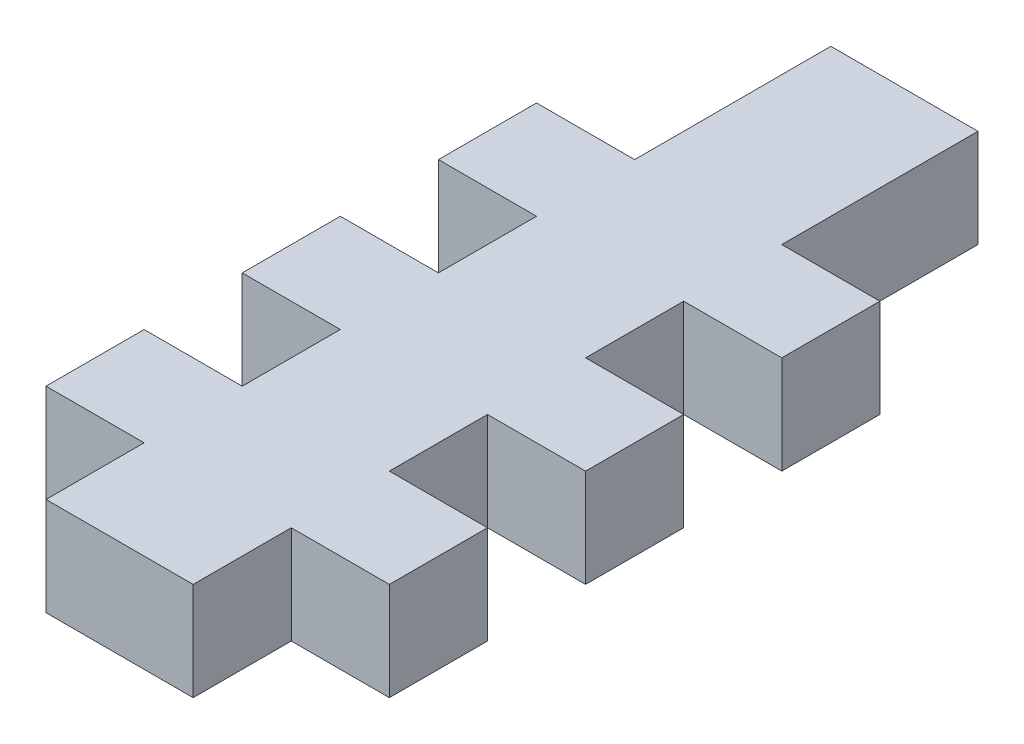
ISO-10303-21;
HEADER;
FILE_DESCRIPTION(('STEP AP214'),'2;1');
FILE_NAME('part.step','',(''),(''),'','','');
FILE_SCHEMA(('AUTOMOTIVE_DESIGN { 1 0 10303 214 1 1 1 1 }'));
ENDSEC;
DATA;
#1=APPLICATION_CONTEXT('core data for automotive mechanical design processes');
#2=APPLICATION_PROTOCOL_DEFINITION('international standard','automotive_design',2000,#1);
#3=PRODUCT_CONTEXT('',#1,'mechanical');
#4=PRODUCT('Part','Part','',(#3));
#5=PRODUCT_RELATED_PRODUCT_CATEGORY('part','',(#4));
#6=PRODUCT_DEFINITION_FORMATION('','',#4);
#7=PRODUCT_DEFINITION_CONTEXT('part definition',#1,'design');
#8=PRODUCT_DEFINITION('design','',#6,#7);
#9=PRODUCT_DEFINITION_SHAPE('','',#8);
#10=(LENGTH_UNIT() NAMED_UNIT(*) SI_UNIT(.MILLI.,.METRE.));
#11=(NAMED_UNIT(*) PLANE_ANGLE_UNIT() SI_UNIT($,.RADIAN.));
#12=(NAMED_UNIT(*) SI_UNIT($,.STERADIAN.) SOLID_ANGLE_UNIT());
#13=UNCERTAINTY_MEASURE_WITH_UNIT(LENGTH_MEASURE(1.E-05),#10,'distance_accuracy_value','');
#14=(GEOMETRIC_REPRESENTATION_CONTEXT(3) GLOBAL_UNCERTAINTY_ASSIGNED_CONTEXT((#13)) GLOBAL_UNIT_ASSIGNED_CONTEXT((#10,
#11,#12)) REPRESENTATION_CONTEXT('',''));
#15=CARTESIAN_POINT('',(0.,0.,0.));
#16=DIRECTION('',(0.,0.,1.));
#17=DIRECTION('',(1.,0.,0.));
#18=AXIS2_PLACEMENT_3D('',#15,#16,#17);
#19=CARTESIAN_POINT('',(0.,12.7,-12.7));
#20=DIRECTION('',(1.,0.,0.));
#21=DIRECTION('',(0.,0.,-1.));
#22=AXIS2_PLACEMENT_3D('',#19,#20,#21);
#23=PLANE('',#22);
#24=DIRECTION('',(0.,0.,1.));
#25=VECTOR('',#24,1.);
#26=CARTESIAN_POINT('',(0.,0.,-12.7));
#27=LINE('',#26,#25);
#28=CARTESIAN_POINT('',(0.,0.,-12.7));
#29=VERTEX_POINT('',#28);
#30=CARTESIAN_POINT('',(0.,0.,0.));
#31=VERTEX_POINT('',#30);
#32=EDGE_CURVE('E260',#29,#31,#27,.T.);
#33=ORIENTED_EDGE('',*,*,#32,.T.);
#34=DIRECTION('',(0.,-1.,0.));
#35=VECTOR('',#34,1.);
#36=CARTESIAN_POINT('',(0.,12.7,0.));
#37=LINE('',#36,#35);
#38=CARTESIAN_POINT('',(0.,12.7,0.));
#39=VERTEX_POINT('',#38);
#40=EDGE_CURVE('E11',#39,#31,#37,.T.);
#41=ORIENTED_EDGE('',*,*,#40,.F.);
#42=DIRECTION('',(0.,0.,1.));
#43=VECTOR('',#42,1.);
#44=CARTESIAN_POINT('',(0.,12.7,-12.7));
#45=LINE('',#44,#43);
#46=CARTESIAN_POINT('',(0.,12.7,-12.7));
#47=VERTEX_POINT('',#46);
#48=EDGE_CURVE('E342',#47,#39,#45,.T.);
#49=ORIENTED_EDGE('',*,*,#48,.F.);
#50=DIRECTION('',(0.,-1.,0.));
#51=VECTOR('',#50,1.);
#52=CARTESIAN_POINT('',(0.,12.7,-12.7));
#53=LINE('',#52,#51);
#54=EDGE_CURVE('E256',#47,#29,#53,.T.);
#55=ORIENTED_EDGE('',*,*,#54,.T.);
#56=EDGE_LOOP('',(#33,#41,#49,#55));
#57=FACE_BOUND('',#56,.T.);
#58=ADVANCED_FACE('F39',(#57),#23,.F.);
#59=CARTESIAN_POINT('',(0.,12.7,0.));
#60=DIRECTION('',(0.,0.,-1.));
#61=DIRECTION('',(-1.,0.,0.));
#62=AXIS2_PLACEMENT_3D('',#59,#60,#61);
#63=PLANE('',#62);
#64=DIRECTION('',(1.,0.,0.));
#65=VECTOR('',#64,1.);
#66=CARTESIAN_POINT('',(0.,0.,0.));
#67=LINE('',#66,#65);
#68=CARTESIAN_POINT('',(19.05,0.,0.));
#69=VERTEX_POINT('',#68);
#70=EDGE_CURVE('E264',#31,#69,#67,.T.);
#71=ORIENTED_EDGE('',*,*,#70,.T.);
#72=DIRECTION('',(0.,-1.,0.));
#73=VECTOR('',#72,1.);
#74=CARTESIAN_POINT('',(19.05,12.7,0.));
#75=LINE('',#74,#73);
#76=CARTESIAN_POINT('',(19.05,12.7,0.));
#77=VERTEX_POINT('',#76);
#78=EDGE_CURVE('E48',#77,#69,#75,.T.);
#79=ORIENTED_EDGE('',*,*,#78,.F.);
#80=DIRECTION('',(1.,0.,0.));
#81=VECTOR('',#80,1.);
#82=CARTESIAN_POINT('',(0.,12.7,0.));
#83=LINE('',#82,#81);
#84=EDGE_CURVE('E159',#39,#77,#83,.T.);
#85=ORIENTED_EDGE('',*,*,#84,.F.);
#86=ORIENTED_EDGE('',*,*,#40,.T.);
#87=EDGE_LOOP('',(#71,#79,#85,#86));
#88=FACE_BOUND('',#87,.T.);
#89=ADVANCED_FACE('F548',(#88),#63,.F.);
#90=CARTESIAN_POINT('',(19.05,12.7,0.));
#91=DIRECTION('',(-1.,0.,0.));
#92=DIRECTION('',(0.,0.,1.));
#93=AXIS2_PLACEMENT_3D('',#90,#91,#92);
#94=PLANE('',#93);
#95=DIRECTION('',(0.,0.,-1.));
#96=VECTOR('',#95,1.);
#97=CARTESIAN_POINT('',(19.05,0.,0.));
#98=LINE('',#97,#96);
#99=CARTESIAN_POINT('',(19.05,0.,-12.7));
#100=VERTEX_POINT('',#99);
#101=EDGE_CURVE('E267',#69,#100,#98,.T.);
#102=ORIENTED_EDGE('',*,*,#101,.T.);
#103=DIRECTION('',(0.,-1.,0.));
#104=VECTOR('',#103,1.);
#105=CARTESIAN_POINT('',(19.05,12.7,-12.7));
#106=LINE('',#105,#104);
#107=CARTESIAN_POINT('',(19.05,12.7,-12.7));
#108=VERTEX_POINT('',#107);
#109=EDGE_CURVE('E433',#108,#100,#106,.T.);
#110=ORIENTED_EDGE('',*,*,#109,.F.);
#111=DIRECTION('',(0.,0.,-1.));
#112=VECTOR('',#111,1.);
#113=CARTESIAN_POINT('',(19.05,12.7,0.));
#114=LINE('',#113,#112);
#115=EDGE_CURVE('E443',#77,#108,#114,.T.);
#116=ORIENTED_EDGE('',*,*,#115,.F.);
#117=ORIENTED_EDGE('',*,*,#78,.T.);
#118=EDGE_LOOP('',(#102,#110,#116,#117));
#119=FACE_BOUND('',#118,.T.);
#120=ADVANCED_FACE('F441',(#119),#94,.F.);
#121=CARTESIAN_POINT('',(19.05,12.7,-12.7));
#122=DIRECTION('',(0.,0.,-1.));
#123=DIRECTION('',(-1.,0.,0.));
#124=AXIS2_PLACEMENT_3D('',#121,#122,#123);
#125=PLANE('',#124);
#126=DIRECTION('',(1.,0.,0.));
#127=VECTOR('',#126,1.);
#128=CARTESIAN_POINT('',(19.05,0.,-12.7));
#129=LINE('',#128,#127);
#130=CARTESIAN_POINT('',(31.75,0.,-12.7));
#131=VERTEX_POINT('',#130);
#132=EDGE_CURVE('E270',#100,#131,#129,.T.);
#133=ORIENTED_EDGE('',*,*,#132,.T.);
#134=DIRECTION('',(0.,-1.,0.));
#135=VECTOR('',#134,1.);
#136=CARTESIAN_POINT('',(31.75,12.7,-12.7));
#137=LINE('',#136,#135);
#138=CARTESIAN_POINT('',(31.75,12.7,-12.7));
#139=VERTEX_POINT('',#138);
#140=EDGE_CURVE('E429',#139,#131,#137,.T.);
#141=ORIENTED_EDGE('',*,*,#140,.F.);
#142=DIRECTION('',(1.,0.,0.));
#143=VECTOR('',#142,1.);
#144=CARTESIAN_POINT('',(19.05,12.7,-12.7));
#145=LINE('',#144,#143);
#146=EDGE_CURVE('E462',#108,#139,#145,.T.);
#147=ORIENTED_EDGE('',*,*,#146,.F.);
#148=ORIENTED_EDGE('',*,*,#109,.T.);
#149=EDGE_LOOP('',(#133,#141,#147,#148));
#150=FACE_BOUND('',#149,.T.);
#151=ADVANCED_FACE('F452',(#150),#125,.F.);
#152=CARTESIAN_POINT('',(31.75,12.7,-12.7));
#153=DIRECTION('',(-1.,0.,0.));
#154=DIRECTION('',(0.,0.,1.));
#155=AXIS2_PLACEMENT_3D('',#152,#153,#154);
#156=PLANE('',#155);
#157=DIRECTION('',(0.,0.,-1.));
#158=VECTOR('',#157,1.);
#159=CARTESIAN_POINT('',(31.75,0.,-12.7));
#160=LINE('',#159,#158);
#161=CARTESIAN_POINT('',(31.75,0.,-25.4));
#162=VERTEX_POINT('',#161);
#163=EDGE_CURVE('E273',#131,#162,#160,.T.);
#164=ORIENTED_EDGE('',*,*,#163,.T.);
#165=DIRECTION('',(0.,-1.,0.));
#166=VECTOR('',#165,1.);
#167=CARTESIAN_POINT('',(31.75,12.7,-25.4));
#168=LINE('',#167,#166);
#169=CARTESIAN_POINT('',(31.75,12.7,-25.4));
#170=VERTEX_POINT('',#169);
#171=EDGE_CURVE('E425',#170,#162,#168,.T.);
#172=ORIENTED_EDGE('',*,*,#171,.F.);
#173=DIRECTION('',(0.,0.,-1.));
#174=VECTOR('',#173,1.);
#175=CARTESIAN_POINT('',(31.75,12.7,-12.7));
#176=LINE('',#175,#174);
#177=EDGE_CURVE('E458',#139,#170,#176,.T.);
#178=ORIENTED_EDGE('',*,*,#177,.F.);
#179=ORIENTED_EDGE('',*,*,#140,.T.);
#180=EDGE_LOOP('',(#164,#172,#178,#179));
#181=FACE_BOUND('',#180,.T.);
#182=ADVANCED_FACE('F456',(#181),#156,.F.);
#183=CARTESIAN_POINT('',(31.75,12.7,-25.4));
#184=DIRECTION('',(0.,0.,1.));
#185=DIRECTION('',(1.,0.,0.));
#186=AXIS2_PLACEMENT_3D('',#183,#184,#185);
#187=PLANE('',#186);
#188=DIRECTION('',(-1.,0.,0.));
#189=VECTOR('',#188,1.);
#190=CARTESIAN_POINT('',(31.75,0.,-25.4));
#191=LINE('',#190,#189);
#192=CARTESIAN_POINT('',(19.05,0.,-25.4));
#193=VERTEX_POINT('',#192);
#194=EDGE_CURVE('E276',#162,#193,#191,.T.);
#195=ORIENTED_EDGE('',*,*,#194,.T.);
#196=DIRECTION('',(0.,-1.,0.));
#197=VECTOR('',#196,1.);
#198=CARTESIAN_POINT('',(19.05,12.7,-25.4));
#199=LINE('',#198,#197);
#200=CARTESIAN_POINT('',(19.05,12.7,-25.4));
#201=VERTEX_POINT('',#200);
#202=EDGE_CURVE('E421',#201,#193,#199,.T.);
#203=ORIENTED_EDGE('',*,*,#202,.F.);
#204=DIRECTION('',(-1.,0.,0.));
#205=VECTOR('',#204,1.);
#206=CARTESIAN_POINT('',(31.75,12.7,-25.4));
#207=LINE('',#206,#205);
#208=EDGE_CURVE('E461',#170,#201,#207,.T.);
#209=ORIENTED_EDGE('',*,*,#208,.F.);
#210=ORIENTED_EDGE('',*,*,#171,.T.);
#211=EDGE_LOOP('',(#195,#203,#209,#210));
#212=FACE_BOUND('',#211,.T.);
#213=ADVANCED_FACE('F561',(#212),#187,.F.);
#214=CARTESIAN_POINT('',(19.05,12.7,-25.4));
#215=DIRECTION('',(-1.,0.,0.));
#216=DIRECTION('',(0.,0.,1.));
#217=AXIS2_PLACEMENT_3D('',#214,#215,#216);
#218=PLANE('',#217);
#219=DIRECTION('',(0.,0.,-1.));
#220=VECTOR('',#219,1.);
#221=CARTESIAN_POINT('',(19.05,0.,-25.4));
#222=LINE('',#221,#220);
#223=CARTESIAN_POINT('',(19.05,0.,-38.1));
#224=VERTEX_POINT('',#223);
#225=EDGE_CURVE('E279',#193,#224,#222,.T.);
#226=ORIENTED_EDGE('',*,*,#225,.T.);
#227=DIRECTION('',(0.,-1.,0.));
#228=VECTOR('',#227,1.);
#229=CARTESIAN_POINT('',(19.05,12.7,-38.1));
#230=LINE('',#229,#228);
#231=CARTESIAN_POINT('',(19.05,12.7,-38.1));
#232=VERTEX_POINT('',#231);
#233=EDGE_CURVE('E417',#232,#224,#230,.T.);
#234=ORIENTED_EDGE('',*,*,#233,.F.);
#235=DIRECTION('',(0.,0.,-1.));
#236=VECTOR('',#235,1.);
#237=CARTESIAN_POINT('',(19.05,12.7,-25.4));
#238=LINE('',#237,#236);
#239=EDGE_CURVE('E466',#201,#232,#238,.T.);
#240=ORIENTED_EDGE('',*,*,#239,.F.);
#241=ORIENTED_EDGE('',*,*,#202,.T.);
#242=EDGE_LOOP('',(#226,#234,#240,#241));
#243=FACE_BOUND('',#242,.T.);
#244=ADVANCED_FACE('F564',(#243),#218,.F.);
#245=CARTESIAN_POINT('',(19.05,12.7,-38.1));
#246=DIRECTION('',(0.,0.,-1.));
#247=DIRECTION('',(-1.,0.,0.));
#248=AXIS2_PLACEMENT_3D('',#245,#246,#247);
#249=PLANE('',#248);
#250=DIRECTION('',(1.,0.,0.));
#251=VECTOR('',#250,1.);
#252=CARTESIAN_POINT('',(19.05,0.,-38.1));
#253=LINE('',#252,#251);
#254=CARTESIAN_POINT('',(31.75,0.,-38.1));
#255=VERTEX_POINT('',#254);
#256=EDGE_CURVE('E282',#224,#255,#253,.T.);
#257=ORIENTED_EDGE('',*,*,#256,.T.);
#258=DIRECTION('',(0.,-1.,0.));
#259=VECTOR('',#258,1.);
#260=CARTESIAN_POINT('',(31.75,12.7,-38.1));
#261=LINE('',#260,#259);
#262=CARTESIAN_POINT('',(31.75,12.7,-38.1));
#263=VERTEX_POINT('',#262);
#264=EDGE_CURVE('E413',#263,#255,#261,.T.);
#265=ORIENTED_EDGE('',*,*,#264,.F.);
#266=DIRECTION('',(1.,0.,0.));
#267=VECTOR('',#266,1.);
#268=CARTESIAN_POINT('',(19.05,12.7,-38.1));
#269=LINE('',#268,#267);
#270=EDGE_CURVE('E473',#232,#263,#269,.T.);
#271=ORIENTED_EDGE('',*,*,#270,.F.);
#272=ORIENTED_EDGE('',*,*,#233,.T.);
#273=EDGE_LOOP('',(#257,#265,#271,#272));
#274=FACE_BOUND('',#273,.T.);
#275=ADVANCED_FACE('F568',(#274),#249,.F.);
#276=CARTESIAN_POINT('',(31.75,12.7,-38.1));
#277=DIRECTION('',(-1.,0.,0.));
#278=DIRECTION('',(0.,0.,1.));
#279=AXIS2_PLACEMENT_3D('',#276,#277,#278);
#280=PLANE('',#279);
#281=DIRECTION('',(0.,0.,-1.));
#282=VECTOR('',#281,1.);
#283=CARTESIAN_POINT('',(31.75,0.,-38.1));
#284=LINE('',#283,#282);
#285=CARTESIAN_POINT('',(31.75,0.,-50.8));
#286=VERTEX_POINT('',#285);
#287=EDGE_CURVE('E285',#255,#286,#284,.T.);
#288=ORIENTED_EDGE('',*,*,#287,.T.);
#289=DIRECTION('',(0.,-1.,0.));
#290=VECTOR('',#289,1.);
#291=CARTESIAN_POINT('',(31.75,12.7,-50.8));
#292=LINE('',#291,#290);
#293=CARTESIAN_POINT('',(31.75,12.7,-50.8));
#294=VERTEX_POINT('',#293);
#295=EDGE_CURVE('E409',#294,#286,#292,.T.);
#296=ORIENTED_EDGE('',*,*,#295,.F.);
#297=DIRECTION('',(0.,0.,-1.));
#298=VECTOR('',#297,1.);
#299=CARTESIAN_POINT('',(31.75,12.7,-38.1));
#300=LINE('',#299,#298);
#301=EDGE_CURVE('E476',#263,#294,#300,.T.);
#302=ORIENTED_EDGE('',*,*,#301,.F.);
#303=ORIENTED_EDGE('',*,*,#264,.T.);
#304=EDGE_LOOP('',(#288,#296,#302,#303));
#305=FACE_BOUND('',#304,.T.);
#306=ADVANCED_FACE('F572',(#305),#280,.F.);
#307=CARTESIAN_POINT('',(31.75,12.7,-50.8));
#308=DIRECTION('',(0.,0.,1.));
#309=DIRECTION('',(1.,0.,0.));
#310=AXIS2_PLACEMENT_3D('',#307,#308,#309);
#311=PLANE('',#310);
#312=DIRECTION('',(-1.,0.,0.));
#313=VECTOR('',#312,1.);
#314=CARTESIAN_POINT('',(31.75,0.,-50.8));
#315=LINE('',#314,#313);
#316=CARTESIAN_POINT('',(19.05,0.,-50.8));
#317=VERTEX_POINT('',#316);
#318=EDGE_CURVE('E288',#286,#317,#315,.T.);
#319=ORIENTED_EDGE('',*,*,#318,.T.);
#320=DIRECTION('',(0.,-1.,0.));
#321=VECTOR('',#320,1.);
#322=CARTESIAN_POINT('',(19.05,12.7,-50.8));
#323=LINE('',#322,#321);
#324=CARTESIAN_POINT('',(19.05,12.7,-50.8));
#325=VERTEX_POINT('',#324);
#326=EDGE_CURVE('E405',#325,#317,#323,.T.);
#327=ORIENTED_EDGE('',*,*,#326,.F.);
#328=DIRECTION('',(-1.,0.,0.));
#329=VECTOR('',#328,1.);
#330=CARTESIAN_POINT('',(31.75,12.7,-50.8));
#331=LINE('',#330,#329);
#332=EDGE_CURVE('E479',#294,#325,#331,.T.);
#333=ORIENTED_EDGE('',*,*,#332,.F.);
#334=ORIENTED_EDGE('',*,*,#295,.T.);
#335=EDGE_LOOP('',(#319,#327,#333,#334));
#336=FACE_BOUND('',#335,.T.);
#337=ADVANCED_FACE('F576',(#336),#311,.F.);
#338=CARTESIAN_POINT('',(19.05,12.7,-50.8));
#339=DIRECTION('',(-1.,0.,0.));
#340=DIRECTION('',(0.,0.,1.));
#341=AXIS2_PLACEMENT_3D('',#338,#339,#340);
#342=PLANE('',#341);
#343=DIRECTION('',(0.,0.,-1.));
#344=VECTOR('',#343,1.);
#345=CARTESIAN_POINT('',(19.05,0.,-50.8));
#346=LINE('',#345,#344);
#347=CARTESIAN_POINT('',(19.05,0.,-63.5));
#348=VERTEX_POINT('',#347);
#349=EDGE_CURVE('E291',#317,#348,#346,.T.);
#350=ORIENTED_EDGE('',*,*,#349,.T.);
#351=DIRECTION('',(0.,-1.,0.));
#352=VECTOR('',#351,1.);
#353=CARTESIAN_POINT('',(19.05,12.7,-63.5));
#354=LINE('',#353,#352);
#355=CARTESIAN_POINT('',(19.05,12.7,-63.5));
#356=VERTEX_POINT('',#355);
#357=EDGE_CURVE('E401',#356,#348,#354,.T.);
#358=ORIENTED_EDGE('',*,*,#357,.F.);
#359=DIRECTION('',(0.,0.,-1.));
#360=VECTOR('',#359,1.);
#361=CARTESIAN_POINT('',(19.05,12.7,-50.8));
#362=LINE('',#361,#360);
#363=EDGE_CURVE('E482',#325,#356,#362,.T.);
#364=ORIENTED_EDGE('',*,*,#363,.F.);
#365=ORIENTED_EDGE('',*,*,#326,.T.);
#366=EDGE_LOOP('',(#350,#358,#364,#365));
#367=FACE_BOUND('',#366,.T.);
#368=ADVANCED_FACE('F580',(#367),#342,.F.);
#369=CARTESIAN_POINT('',(19.05,12.7,-63.5));
#370=DIRECTION('',(0.,0.,-1.));
#371=DIRECTION('',(-1.,0.,0.));
#372=AXIS2_PLACEMENT_3D('',#369,#370,#371);
#373=PLANE('',#372);
#374=DIRECTION('',(1.,0.,0.));
#375=VECTOR('',#374,1.);
#376=CARTESIAN_POINT('',(19.05,0.,-63.5));
#377=LINE('',#376,#375);
#378=CARTESIAN_POINT('',(31.75,0.,-63.5));
#379=VERTEX_POINT('',#378);
#380=EDGE_CURVE('E294',#348,#379,#377,.T.);
#381=ORIENTED_EDGE('',*,*,#380,.T.);
#382=DIRECTION('',(0.,-1.,0.));
#383=VECTOR('',#382,1.);
#384=CARTESIAN_POINT('',(31.75,12.7,-63.5));
#385=LINE('',#384,#383);
#386=CARTESIAN_POINT('',(31.75,12.7,-63.5));
#387=VERTEX_POINT('',#386);
#388=EDGE_CURVE('E397',#387,#379,#385,.T.);
#389=ORIENTED_EDGE('',*,*,#388,.F.);
#390=DIRECTION('',(1.,0.,0.));
#391=VECTOR('',#390,1.);
#392=CARTESIAN_POINT('',(19.05,12.7,-63.5));
#393=LINE('',#392,#391);
#394=EDGE_CURVE('E485',#356,#387,#393,.T.);
#395=ORIENTED_EDGE('',*,*,#394,.F.);
#396=ORIENTED_EDGE('',*,*,#357,.T.);
#397=EDGE_LOOP('',(#381,#389,#395,#396));
#398=FACE_BOUND('',#397,.T.);
#399=ADVANCED_FACE('F584',(#398),#373,.F.);
#400=CARTESIAN_POINT('',(31.75,12.7,-63.5));
#401=DIRECTION('',(-1.,0.,0.));
#402=DIRECTION('',(0.,0.,1.));
#403=AXIS2_PLACEMENT_3D('',#400,#401,#402);
#404=PLANE('',#403);
#405=DIRECTION('',(0.,0.,-1.));
#406=VECTOR('',#405,1.);
#407=CARTESIAN_POINT('',(31.75,0.,-63.5));
#408=LINE('',#407,#406);
#409=CARTESIAN_POINT('',(31.75,0.,-76.2));
#410=VERTEX_POINT('',#409);
#411=EDGE_CURVE('E297',#379,#410,#408,.T.);
#412=ORIENTED_EDGE('',*,*,#411,.T.);
#413=DIRECTION('',(0.,-1.,0.));
#414=VECTOR('',#413,1.);
#415=CARTESIAN_POINT('',(31.75,12.7,-76.2));
#416=LINE('',#415,#414);
#417=CARTESIAN_POINT('',(31.75,12.7,-76.2));
#418=VERTEX_POINT('',#417);
#419=EDGE_CURVE('E393',#418,#410,#416,.T.);
#420=ORIENTED_EDGE('',*,*,#419,.F.);
#421=DIRECTION('',(0.,0.,-1.));
#422=VECTOR('',#421,1.);
#423=CARTESIAN_POINT('',(31.75,12.7,-63.5));
#424=LINE('',#423,#422);
#425=EDGE_CURVE('E488',#387,#418,#424,.T.);
#426=ORIENTED_EDGE('',*,*,#425,.F.);
#427=ORIENTED_EDGE('',*,*,#388,.T.);
#428=EDGE_LOOP('',(#412,#420,#426,#427));
#429=FACE_BOUND('',#428,.T.);
#430=ADVANCED_FACE('F588',(#429),#404,.F.);
#431=CARTESIAN_POINT('',(31.75,12.7,-76.2));
#432=DIRECTION('',(0.,0.,1.));
#433=DIRECTION('',(1.,0.,0.));
#434=AXIS2_PLACEMENT_3D('',#431,#432,#433);
#435=PLANE('',#434);
#436=DIRECTION('',(-1.,0.,0.));
#437=VECTOR('',#436,1.);
#438=CARTESIAN_POINT('',(31.75,0.,-76.2));
#439=LINE('',#438,#437);
#440=CARTESIAN_POINT('',(19.05,0.,-76.2));
#441=VERTEX_POINT('',#440);
#442=EDGE_CURVE('E300',#410,#441,#439,.T.);
#443=ORIENTED_EDGE('',*,*,#442,.T.);
#444=DIRECTION('',(0.,-1.,0.));
#445=VECTOR('',#444,1.);
#446=CARTESIAN_POINT('',(19.05,12.7,-76.2));
#447=LINE('',#446,#445);
#448=CARTESIAN_POINT('',(19.05,12.7,-76.2));
#449=VERTEX_POINT('',#448);
#450=EDGE_CURVE('E389',#449,#441,#447,.T.);
#451=ORIENTED_EDGE('',*,*,#450,.F.);
#452=DIRECTION('',(-1.,0.,0.));
#453=VECTOR('',#452,1.);
#454=CARTESIAN_POINT('',(31.75,12.7,-76.2));
#455=LINE('',#454,#453);
#456=EDGE_CURVE('E491',#418,#449,#455,.T.);
#457=ORIENTED_EDGE('',*,*,#456,.F.);
#458=ORIENTED_EDGE('',*,*,#419,.T.);
#459=EDGE_LOOP('',(#443,#451,#457,#458));
#460=FACE_BOUND('',#459,.T.);
#461=ADVANCED_FACE('F592',(#460),#435,.F.);
#462=CARTESIAN_POINT('',(19.05,12.7,-76.2));
#463=DIRECTION('',(-1.,0.,0.));
#464=DIRECTION('',(0.,0.,1.));
#465=AXIS2_PLACEMENT_3D('',#462,#463,#464);
#466=PLANE('',#465);
#467=DIRECTION('',(0.,0.,-1.));
#468=VECTOR('',#467,1.);
#469=CARTESIAN_POINT('',(19.05,0.,-76.2));
#470=LINE('',#469,#468);
#471=CARTESIAN_POINT('',(19.05,0.,-101.6));
#472=VERTEX_POINT('',#471);
#473=EDGE_CURVE('E303',#441,#472,#470,.T.);
#474=ORIENTED_EDGE('',*,*,#473,.T.);
#475=DIRECTION('',(0.,-1.,0.));
#476=VECTOR('',#475,1.);
#477=CARTESIAN_POINT('',(19.05,12.7,-101.6));
#478=LINE('',#477,#476);
#479=CARTESIAN_POINT('',(19.05,12.7,-101.6));
#480=VERTEX_POINT('',#479);
#481=EDGE_CURVE('E385',#480,#472,#478,.T.);
#482=ORIENTED_EDGE('',*,*,#481,.F.);
#483=DIRECTION('',(0.,0.,-1.));
#484=VECTOR('',#483,1.);
#485=CARTESIAN_POINT('',(19.05,12.7,-76.2));
#486=LINE('',#485,#484);
#487=EDGE_CURVE('E494',#449,#480,#486,.T.);
#488=ORIENTED_EDGE('',*,*,#487,.F.);
#489=ORIENTED_EDGE('',*,*,#450,.T.);
#490=EDGE_LOOP('',(#474,#482,#488,#489));
#491=FACE_BOUND('',#490,.T.);
#492=ADVANCED_FACE('F596',(#491),#466,.F.);
#493=CARTESIAN_POINT('',(19.05,12.7,-101.6));
#494=DIRECTION('',(0.,0.,1.));
#495=DIRECTION('',(1.,0.,0.));
#496=AXIS2_PLACEMENT_3D('',#493,#494,#495);
#497=PLANE('',#496);
#498=DIRECTION('',(-1.,0.,0.));
#499=VECTOR('',#498,1.);
#500=CARTESIAN_POINT('',(19.05,0.,-101.6));
#501=LINE('',#500,#499);
#502=CARTESIAN_POINT('',(0.,0.,-101.6));
#503=VERTEX_POINT('',#502);
#504=EDGE_CURVE('E306',#472,#503,#501,.T.);
#505=ORIENTED_EDGE('',*,*,#504,.T.);
#506=DIRECTION('',(0.,-1.,0.));
#507=VECTOR('',#506,1.);
#508=CARTESIAN_POINT('',(0.,12.7,-101.6));
#509=LINE('',#508,#507);
#510=CARTESIAN_POINT('',(0.,12.7,-101.6));
#511=VERTEX_POINT('',#510);
#512=EDGE_CURVE('E381',#511,#503,#509,.T.);
#513=ORIENTED_EDGE('',*,*,#512,.F.);
#514=DIRECTION('',(-1.,0.,0.));
#515=VECTOR('',#514,1.);
#516=CARTESIAN_POINT('',(19.05,12.7,-101.6));
#517=LINE('',#516,#515);
#518=EDGE_CURVE('E497',#480,#511,#517,.T.);
#519=ORIENTED_EDGE('',*,*,#518,.F.);
#520=ORIENTED_EDGE('',*,*,#481,.T.);
#521=EDGE_LOOP('',(#505,#513,#519,#520));
#522=FACE_BOUND('',#521,.T.);
#523=ADVANCED_FACE('F600',(#522),#497,.F.);
#524=CARTESIAN_POINT('',(0.,12.7,-101.6));
#525=DIRECTION('',(1.,0.,0.));
#526=DIRECTION('',(0.,0.,-1.));
#527=AXIS2_PLACEMENT_3D('',#524,#525,#526);
#528=PLANE('',#527);
#529=DIRECTION('',(0.,0.,1.));
#530=VECTOR('',#529,1.);
#531=CARTESIAN_POINT('',(0.,0.,-101.6));
#532=LINE('',#531,#530);
#533=CARTESIAN_POINT('',(0.,0.,-76.2));
#534=VERTEX_POINT('',#533);
#535=EDGE_CURVE('E309',#503,#534,#532,.T.);
#536=ORIENTED_EDGE('',*,*,#535,.T.);
#537=DIRECTION('',(0.,-1.,0.));
#538=VECTOR('',#537,1.);
#539=CARTESIAN_POINT('',(0.,12.7,-76.2));
#540=LINE('',#539,#538);
#541=CARTESIAN_POINT('',(0.,12.7,-76.2));
#542=VERTEX_POINT('',#541);
#543=EDGE_CURVE('E377',#542,#534,#540,.T.);
#544=ORIENTED_EDGE('',*,*,#543,.F.);
#545=DIRECTION('',(0.,0.,1.));
#546=VECTOR('',#545,1.);
#547=CARTESIAN_POINT('',(0.,12.7,-101.6));
#548=LINE('',#547,#546);
#549=EDGE_CURVE('E500',#511,#542,#548,.T.);
#550=ORIENTED_EDGE('',*,*,#549,.F.);
#551=ORIENTED_EDGE('',*,*,#512,.T.);
#552=EDGE_LOOP('',(#536,#544,#550,#551));
#553=FACE_BOUND('',#552,.T.);
#554=ADVANCED_FACE('F604',(#553),#528,.F.);
#555=CARTESIAN_POINT('',(0.,12.7,-76.2));
#556=DIRECTION('',(0.,0.,1.));
#557=DIRECTION('',(1.,0.,0.));
#558=AXIS2_PLACEMENT_3D('',#555,#556,#557);
#559=PLANE('',#558);
#560=DIRECTION('',(-1.,0.,0.));
#561=VECTOR('',#560,1.);
#562=CARTESIAN_POINT('',(0.,0.,-76.2));
#563=LINE('',#562,#561);
#564=CARTESIAN_POINT('',(-12.7,0.,-76.2));
#565=VERTEX_POINT('',#564);
#566=EDGE_CURVE('E312',#534,#565,#563,.T.);
#567=ORIENTED_EDGE('',*,*,#566,.T.);
#568=DIRECTION('',(0.,-1.,0.));
#569=VECTOR('',#568,1.);
#570=CARTESIAN_POINT('',(-12.7,12.7,-76.2));
#571=LINE('',#570,#569);
#572=CARTESIAN_POINT('',(-12.7,12.7,-76.2));
#573=VERTEX_POINT('',#572);
#574=EDGE_CURVE('E373',#573,#565,#571,.T.);
#575=ORIENTED_EDGE('',*,*,#574,.F.);
#576=DIRECTION('',(-1.,0.,0.));
#577=VECTOR('',#576,1.);
#578=CARTESIAN_POINT('',(0.,12.7,-76.2));
#579=LINE('',#578,#577);
#580=EDGE_CURVE('E503',#542,#573,#579,.T.);
#581=ORIENTED_EDGE('',*,*,#580,.F.);
#582=ORIENTED_EDGE('',*,*,#543,.T.);
#583=EDGE_LOOP('',(#567,#575,#581,#582));
#584=FACE_BOUND('',#583,.T.);
#585=ADVANCED_FACE('F608',(#584),#559,.F.);
#586=CARTESIAN_POINT('',(-12.7,12.7,-76.2));
#587=DIRECTION('',(1.,0.,0.));
#588=DIRECTION('',(0.,0.,-1.));
#589=AXIS2_PLACEMENT_3D('',#586,#587,#588);
#590=PLANE('',#589);
#591=DIRECTION('',(0.,0.,1.));
#592=VECTOR('',#591,1.);
#593=CARTESIAN_POINT('',(-12.7,0.,-76.2));
#594=LINE('',#593,#592);
#595=CARTESIAN_POINT('',(-12.7,0.,-63.5));
#596=VERTEX_POINT('',#595);
#597=EDGE_CURVE('E315',#565,#596,#594,.T.);
#598=ORIENTED_EDGE('',*,*,#597,.T.);
#599=DIRECTION('',(0.,-1.,0.));
#600=VECTOR('',#599,1.);
#601=CARTESIAN_POINT('',(-12.7,12.7,-63.5));
#602=LINE('',#601,#600);
#603=CARTESIAN_POINT('',(-12.7,12.7,-63.5));
#604=VERTEX_POINT('',#603);
#605=EDGE_CURVE('E369',#604,#596,#602,.T.);
#606=ORIENTED_EDGE('',*,*,#605,.F.);
#607=DIRECTION('',(0.,0.,1.));
#608=VECTOR('',#607,1.);
#609=CARTESIAN_POINT('',(-12.7,12.7,-76.2));
#610=LINE('',#609,#608);
#611=EDGE_CURVE('E506',#573,#604,#610,.T.);
#612=ORIENTED_EDGE('',*,*,#611,.F.);
#613=ORIENTED_EDGE('',*,*,#574,.T.);
#614=EDGE_LOOP('',(#598,#606,#612,#613));
#615=FACE_BOUND('',#614,.T.);
#616=ADVANCED_FACE('F612',(#615),#590,.F.);
#617=CARTESIAN_POINT('',(-12.7,12.7,-63.5));
#618=DIRECTION('',(0.,0.,-1.));
#619=DIRECTION('',(-1.,0.,0.));
#620=AXIS2_PLACEMENT_3D('',#617,#618,#619);
#621=PLANE('',#620);
#622=DIRECTION('',(1.,0.,0.));
#623=VECTOR('',#622,1.);
#624=CARTESIAN_POINT('',(-12.7,0.,-63.5));
#625=LINE('',#624,#623);
#626=CARTESIAN_POINT('',(0.,0.,-63.5));
#627=VERTEX_POINT('',#626);
#628=EDGE_CURVE('E318',#596,#627,#625,.T.);
#629=ORIENTED_EDGE('',*,*,#628,.T.);
#630=DIRECTION('',(0.,-1.,0.));
#631=VECTOR('',#630,1.);
#632=CARTESIAN_POINT('',(0.,12.7,-63.5));
#633=LINE('',#632,#631);
#634=CARTESIAN_POINT('',(0.,12.7,-63.5));
#635=VERTEX_POINT('',#634);
#636=EDGE_CURVE('E365',#635,#627,#633,.T.);
#637=ORIENTED_EDGE('',*,*,#636,.F.);
#638=DIRECTION('',(1.,0.,0.));
#639=VECTOR('',#638,1.);
#640=CARTESIAN_POINT('',(-12.7,12.7,-63.5));
#641=LINE('',#640,#639);
#642=EDGE_CURVE('E509',#604,#635,#641,.T.);
#643=ORIENTED_EDGE('',*,*,#642,.F.);
#644=ORIENTED_EDGE('',*,*,#605,.T.);
#645=EDGE_LOOP('',(#629,#637,#643,#644));
#646=FACE_BOUND('',#645,.T.);
#647=ADVANCED_FACE('F616',(#646),#621,.F.);
#648=CARTESIAN_POINT('',(0.,12.7,-63.5));
#649=DIRECTION('',(1.,0.,0.));
#650=DIRECTION('',(0.,0.,-1.));
#651=AXIS2_PLACEMENT_3D('',#648,#649,#650);
#652=PLANE('',#651);
#653=DIRECTION('',(0.,0.,1.));
#654=VECTOR('',#653,1.);
#655=CARTESIAN_POINT('',(0.,0.,-63.5));
#656=LINE('',#655,#654);
#657=CARTESIAN_POINT('',(0.,0.,-50.8));
#658=VERTEX_POINT('',#657);
#659=EDGE_CURVE('E321',#627,#658,#656,.T.);
#660=ORIENTED_EDGE('',*,*,#659,.T.);
#661=DIRECTION('',(0.,-1.,0.));
#662=VECTOR('',#661,1.);
#663=CARTESIAN_POINT('',(0.,12.7,-50.8));
#664=LINE('',#663,#662);
#665=CARTESIAN_POINT('',(0.,12.7,-50.8));
#666=VERTEX_POINT('',#665);
#667=EDGE_CURVE('E361',#666,#658,#664,.T.);
#668=ORIENTED_EDGE('',*,*,#667,.F.);
#669=DIRECTION('',(0.,0.,1.));
#670=VECTOR('',#669,1.);
#671=CARTESIAN_POINT('',(0.,12.7,-63.5));
#672=LINE('',#671,#670);
#673=EDGE_CURVE('E512',#635,#666,#672,.T.);
#674=ORIENTED_EDGE('',*,*,#673,.F.);
#675=ORIENTED_EDGE('',*,*,#636,.T.);
#676=EDGE_LOOP('',(#660,#668,#674,#675));
#677=FACE_BOUND('',#676,.T.);
#678=ADVANCED_FACE('F620',(#677),#652,.F.);
#679=CARTESIAN_POINT('',(0.,12.7,-50.8));
#680=DIRECTION('',(0.,0.,1.));
#681=DIRECTION('',(1.,0.,0.));
#682=AXIS2_PLACEMENT_3D('',#679,#680,#681);
#683=PLANE('',#682);
#684=DIRECTION('',(-1.,0.,0.));
#685=VECTOR('',#684,1.);
#686=CARTESIAN_POINT('',(0.,0.,-50.8));
#687=LINE('',#686,#685);
#688=CARTESIAN_POINT('',(-12.7,0.,-50.8));
#689=VERTEX_POINT('',#688);
#690=EDGE_CURVE('E324',#658,#689,#687,.T.);
#691=ORIENTED_EDGE('',*,*,#690,.T.);
#692=DIRECTION('',(0.,-1.,0.));
#693=VECTOR('',#692,1.);
#694=CARTESIAN_POINT('',(-12.7,12.7,-50.8));
#695=LINE('',#694,#693);
#696=CARTESIAN_POINT('',(-12.7,12.7,-50.8));
#697=VERTEX_POINT('',#696);
#698=EDGE_CURVE('E357',#697,#689,#695,.T.);
#699=ORIENTED_EDGE('',*,*,#698,.F.);
#700=DIRECTION('',(-1.,0.,0.));
#701=VECTOR('',#700,1.);
#702=CARTESIAN_POINT('',(0.,12.7,-50.8));
#703=LINE('',#702,#701);
#704=EDGE_CURVE('E515',#666,#697,#703,.T.);
#705=ORIENTED_EDGE('',*,*,#704,.F.);
#706=ORIENTED_EDGE('',*,*,#667,.T.);
#707=EDGE_LOOP('',(#691,#699,#705,#706));
#708=FACE_BOUND('',#707,.T.);
#709=ADVANCED_FACE('F624',(#708),#683,.F.);
#710=CARTESIAN_POINT('',(-12.7,12.7,-50.8));
#711=DIRECTION('',(1.,0.,0.));
#712=DIRECTION('',(0.,0.,-1.));
#713=AXIS2_PLACEMENT_3D('',#710,#711,#712);
#714=PLANE('',#713);
#715=DIRECTION('',(0.,0.,1.));
#716=VECTOR('',#715,1.);
#717=CARTESIAN_POINT('',(-12.7,0.,-50.8));
#718=LINE('',#717,#716);
#719=CARTESIAN_POINT('',(-12.7,0.,-38.1));
#720=VERTEX_POINT('',#719);
#721=EDGE_CURVE('E327',#689,#720,#718,.T.);
#722=ORIENTED_EDGE('',*,*,#721,.T.);
#723=DIRECTION('',(0.,-1.,0.));
#724=VECTOR('',#723,1.);
#725=CARTESIAN_POINT('',(-12.7,12.7,-38.1));
#726=LINE('',#725,#724);
#727=CARTESIAN_POINT('',(-12.7,12.7,-38.1));
#728=VERTEX_POINT('',#727);
#729=EDGE_CURVE('E353',#728,#720,#726,.T.);
#730=ORIENTED_EDGE('',*,*,#729,.F.);
#731=DIRECTION('',(0.,0.,1.));
#732=VECTOR('',#731,1.);
#733=CARTESIAN_POINT('',(-12.7,12.7,-50.8));
#734=LINE('',#733,#732);
#735=EDGE_CURVE('E518',#697,#728,#734,.T.);
#736=ORIENTED_EDGE('',*,*,#735,.F.);
#737=ORIENTED_EDGE('',*,*,#698,.T.);
#738=EDGE_LOOP('',(#722,#730,#736,#737));
#739=FACE_BOUND('',#738,.T.);
#740=ADVANCED_FACE('F628',(#739),#714,.F.);
#741=CARTESIAN_POINT('',(-12.7,12.7,-38.1));
#742=DIRECTION('',(0.,0.,-1.));
#743=DIRECTION('',(-1.,0.,0.));
#744=AXIS2_PLACEMENT_3D('',#741,#742,#743);
#745=PLANE('',#744);
#746=DIRECTION('',(1.,0.,0.));
#747=VECTOR('',#746,1.);
#748=CARTESIAN_POINT('',(-12.7,0.,-38.1));
#749=LINE('',#748,#747);
#750=CARTESIAN_POINT('',(0.,0.,-38.1));
#751=VERTEX_POINT('',#750);
#752=EDGE_CURVE('E330',#720,#751,#749,.T.);
#753=ORIENTED_EDGE('',*,*,#752,.T.);
#754=DIRECTION('',(0.,-1.,0.));
#755=VECTOR('',#754,1.);
#756=CARTESIAN_POINT('',(0.,12.7,-38.1));
#757=LINE('',#756,#755);
#758=CARTESIAN_POINT('',(0.,12.7,-38.1));
#759=VERTEX_POINT('',#758);
#760=EDGE_CURVE('E349',#759,#751,#757,.T.);
#761=ORIENTED_EDGE('',*,*,#760,.F.);
#762=DIRECTION('',(1.,0.,0.));
#763=VECTOR('',#762,1.);
#764=CARTESIAN_POINT('',(-12.7,12.7,-38.1));
#765=LINE('',#764,#763);
#766=EDGE_CURVE('E521',#728,#759,#765,.T.);
#767=ORIENTED_EDGE('',*,*,#766,.F.);
#768=ORIENTED_EDGE('',*,*,#729,.T.);
#769=EDGE_LOOP('',(#753,#761,#767,#768));
#770=FACE_BOUND('',#769,.T.);
#771=ADVANCED_FACE('F529',(#770),#745,.F.);
#772=CARTESIAN_POINT('',(0.,12.7,-38.1));
#773=DIRECTION('',(1.,0.,0.));
#774=DIRECTION('',(0.,0.,-1.));
#775=AXIS2_PLACEMENT_3D('',#772,#773,#774);
#776=PLANE('',#775);
#777=DIRECTION('',(0.,0.,1.));
#778=VECTOR('',#777,1.);
#779=CARTESIAN_POINT('',(0.,0.,-38.1));
#780=LINE('',#779,#778);
#781=CARTESIAN_POINT('',(0.,0.,-25.4));
#782=VERTEX_POINT('',#781);
#783=EDGE_CURVE('E333',#751,#782,#780,.T.);
#784=ORIENTED_EDGE('',*,*,#783,.T.);
#785=DIRECTION('',(0.,-1.,0.));
#786=VECTOR('',#785,1.);
#787=CARTESIAN_POINT('',(0.,12.7,-25.4));
#788=LINE('',#787,#786);
#789=CARTESIAN_POINT('',(0.,12.7,-25.4));
#790=VERTEX_POINT('',#789);
#791=EDGE_CURVE('E249',#790,#782,#788,.T.);
#792=ORIENTED_EDGE('',*,*,#791,.F.);
#793=DIRECTION('',(0.,0.,1.));
#794=VECTOR('',#793,1.);
#795=CARTESIAN_POINT('',(0.,12.7,-38.1));
#796=LINE('',#795,#794);
#797=EDGE_CURVE('E238',#759,#790,#796,.T.);
#798=ORIENTED_EDGE('',*,*,#797,.F.);
#799=ORIENTED_EDGE('',*,*,#760,.T.);
#800=EDGE_LOOP('',(#784,#792,#798,#799));
#801=FACE_BOUND('',#800,.T.);
#802=ADVANCED_FACE('F533',(#801),#776,.F.);
#803=CARTESIAN_POINT('',(0.,12.7,-25.4));
#804=DIRECTION('',(0.,0.,1.));
#805=DIRECTION('',(1.,0.,0.));
#806=AXIS2_PLACEMENT_3D('',#803,#804,#805);
#807=PLANE('',#806);
#808=DIRECTION('',(-1.,0.,0.));
#809=VECTOR('',#808,1.);
#810=CARTESIAN_POINT('',(0.,0.,-25.4));
#811=LINE('',#810,#809);
#812=CARTESIAN_POINT('',(-12.7,0.,-25.4));
#813=VERTEX_POINT('',#812);
#814=EDGE_CURVE('E247',#782,#813,#811,.T.);
#815=ORIENTED_EDGE('',*,*,#814,.T.);
#816=DIRECTION('',(0.,-1.,0.));
#817=VECTOR('',#816,1.);
#818=CARTESIAN_POINT('',(-12.7,12.7,-25.4));
#819=LINE('',#818,#817);
#820=CARTESIAN_POINT('',(-12.7,12.7,-25.4));
#821=VERTEX_POINT('',#820);
#822=EDGE_CURVE('E244',#821,#813,#819,.T.);
#823=ORIENTED_EDGE('',*,*,#822,.F.);
#824=DIRECTION('',(-1.,0.,0.));
#825=VECTOR('',#824,1.);
#826=CARTESIAN_POINT('',(0.,12.7,-25.4));
#827=LINE('',#826,#825);
#828=EDGE_CURVE('E232',#790,#821,#827,.T.);
#829=ORIENTED_EDGE('',*,*,#828,.F.);
#830=ORIENTED_EDGE('',*,*,#791,.T.);
#831=EDGE_LOOP('',(#815,#823,#829,#830));
#832=FACE_BOUND('',#831,.T.);
#833=ADVANCED_FACE('F245',(#832),#807,.F.);
#834=CARTESIAN_POINT('',(-12.7,12.7,-25.4));
#835=DIRECTION('',(1.,0.,0.));
#836=DIRECTION('',(0.,0.,-1.));
#837=AXIS2_PLACEMENT_3D('',#834,#835,#836);
#838=PLANE('',#837);
#839=DIRECTION('',(0.,0.,1.));
#840=VECTOR('',#839,1.);
#841=CARTESIAN_POINT('',(-12.7,0.,-25.4));
#842=LINE('',#841,#840);
#843=CARTESIAN_POINT('',(-12.7,0.,-12.7));
#844=VERTEX_POINT('',#843);
#845=EDGE_CURVE('E145',#813,#844,#842,.T.);
#846=ORIENTED_EDGE('',*,*,#845,.T.);
#847=DIRECTION('',(0.,-1.,0.));
#848=VECTOR('',#847,1.);
#849=CARTESIAN_POINT('',(-12.7,12.7,-12.7));
#850=LINE('',#849,#848);
#851=CARTESIAN_POINT('',(-12.7,12.7,-12.7));
#852=VERTEX_POINT('',#851);
#853=EDGE_CURVE('E250',#852,#844,#850,.T.);
#854=ORIENTED_EDGE('',*,*,#853,.F.);
#855=DIRECTION('',(0.,0.,1.));
#856=VECTOR('',#855,1.);
#857=CARTESIAN_POINT('',(-12.7,12.7,-25.4));
#858=LINE('',#857,#856);
#859=EDGE_CURVE('E236',#821,#852,#858,.T.);
#860=ORIENTED_EDGE('',*,*,#859,.F.);
#861=ORIENTED_EDGE('',*,*,#822,.T.);
#862=EDGE_LOOP('',(#846,#854,#860,#861));
#863=FACE_BOUND('',#862,.T.);
#864=ADVANCED_FACE('F252',(#863),#838,.F.);
#865=CARTESIAN_POINT('',(-12.7,12.7,-12.7));
#866=DIRECTION('',(0.,0.,-1.));
#867=DIRECTION('',(-1.,0.,0.));
#868=AXIS2_PLACEMENT_3D('',#865,#866,#867);
#869=PLANE('',#868);
#870=DIRECTION('',(1.,0.,0.));
#871=VECTOR('',#870,1.);
#872=CARTESIAN_POINT('',(-12.7,0.,-12.7));
#873=LINE('',#872,#871);
#874=EDGE_CURVE('E151',#844,#29,#873,.T.);
#875=ORIENTED_EDGE('',*,*,#874,.T.);
#876=ORIENTED_EDGE('',*,*,#54,.F.);
#877=DIRECTION('',(1.,0.,0.));
#878=VECTOR('',#877,1.);
#879=CARTESIAN_POINT('',(-12.7,12.7,-12.7));
#880=LINE('',#879,#878);
#881=EDGE_CURVE('E56',#852,#47,#880,.T.);
#882=ORIENTED_EDGE('',*,*,#881,.F.);
#883=ORIENTED_EDGE('',*,*,#853,.T.);
#884=EDGE_LOOP('',(#875,#876,#882,#883));
#885=FACE_BOUND('',#884,.T.);
#886=ADVANCED_FACE('F537',(#885),#869,.F.);
#887=CARTESIAN_POINT('',(0.,12.7,0.));
#888=DIRECTION('',(0.,1.,0.));
#889=DIRECTION('',(0.,0.,1.));
#890=AXIS2_PLACEMENT_3D('',#887,#888,#889);
#891=PLANE('',#890);
#892=ORIENTED_EDGE('',*,*,#48,.T.);
#893=ORIENTED_EDGE('',*,*,#84,.T.);
#894=ORIENTED_EDGE('',*,*,#115,.T.);
#895=ORIENTED_EDGE('',*,*,#146,.T.);
#896=ORIENTED_EDGE('',*,*,#177,.T.);
#897=ORIENTED_EDGE('',*,*,#208,.T.);
#898=ORIENTED_EDGE('',*,*,#239,.T.);
#899=ORIENTED_EDGE('',*,*,#270,.T.);
#900=ORIENTED_EDGE('',*,*,#301,.T.);
#901=ORIENTED_EDGE('',*,*,#332,.T.);
#902=ORIENTED_EDGE('',*,*,#363,.T.);
#903=ORIENTED_EDGE('',*,*,#394,.T.);
#904=ORIENTED_EDGE('',*,*,#425,.T.);
#905=ORIENTED_EDGE('',*,*,#456,.T.);
#906=ORIENTED_EDGE('',*,*,#487,.T.);
#907=ORIENTED_EDGE('',*,*,#518,.T.);
#908=ORIENTED_EDGE('',*,*,#549,.T.);
#909=ORIENTED_EDGE('',*,*,#580,.T.);
#910=ORIENTED_EDGE('',*,*,#611,.T.);
#911=ORIENTED_EDGE('',*,*,#642,.T.);
#912=ORIENTED_EDGE('',*,*,#673,.T.);
#913=ORIENTED_EDGE('',*,*,#704,.T.);
#914=ORIENTED_EDGE('',*,*,#735,.T.);
#915=ORIENTED_EDGE('',*,*,#766,.T.);
#916=ORIENTED_EDGE('',*,*,#797,.T.);
#917=ORIENTED_EDGE('',*,*,#828,.T.);
#918=ORIENTED_EDGE('',*,*,#859,.T.);
#919=ORIENTED_EDGE('',*,*,#881,.T.);
#920=EDGE_LOOP('',(#892,#893,#894,#895,#896,#897,#898,#899,#900,#901,#902,#903,#904,#905,#906,
#907,#908,#909,#910,#911,#912,#913,#914,#915,#916,#917,#918,#919));
#921=FACE_BOUND('',#920,.T.);
#922=ADVANCED_FACE('F234',(#921),#891,.T.);
#923=CARTESIAN_POINT('',(0.,0.,0.));
#924=DIRECTION('',(0.,1.,0.));
#925=DIRECTION('',(0.,0.,1.));
#926=AXIS2_PLACEMENT_3D('',#923,#924,#925);
#927=PLANE('',#926);
#928=ORIENTED_EDGE('',*,*,#32,.F.);
#929=ORIENTED_EDGE('',*,*,#874,.F.);
#930=ORIENTED_EDGE('',*,*,#845,.F.);
#931=ORIENTED_EDGE('',*,*,#814,.F.);
#932=ORIENTED_EDGE('',*,*,#783,.F.);
#933=ORIENTED_EDGE('',*,*,#752,.F.);
#934=ORIENTED_EDGE('',*,*,#721,.F.);
#935=ORIENTED_EDGE('',*,*,#690,.F.);
#936=ORIENTED_EDGE('',*,*,#659,.F.);
#937=ORIENTED_EDGE('',*,*,#628,.F.);
#938=ORIENTED_EDGE('',*,*,#597,.F.);
#939=ORIENTED_EDGE('',*,*,#566,.F.);
#940=ORIENTED_EDGE('',*,*,#535,.F.);
#941=ORIENTED_EDGE('',*,*,#504,.F.);
#942=ORIENTED_EDGE('',*,*,#473,.F.);
#943=ORIENTED_EDGE('',*,*,#442,.F.);
#944=ORIENTED_EDGE('',*,*,#411,.F.);
#945=ORIENTED_EDGE('',*,*,#380,.F.);
#946=ORIENTED_EDGE('',*,*,#349,.F.);
#947=ORIENTED_EDGE('',*,*,#318,.F.);
#948=ORIENTED_EDGE('',*,*,#287,.F.);
#949=ORIENTED_EDGE('',*,*,#256,.F.);
#950=ORIENTED_EDGE('',*,*,#225,.F.);
#951=ORIENTED_EDGE('',*,*,#194,.F.);
#952=ORIENTED_EDGE('',*,*,#163,.F.);
#953=ORIENTED_EDGE('',*,*,#132,.F.);
#954=ORIENTED_EDGE('',*,*,#101,.F.);
#955=ORIENTED_EDGE('',*,*,#70,.F.);
#956=EDGE_LOOP('',(#928,#929,#930,#931,#932,#933,#934,#935,#936,#937,#938,#939,#940,#941,#942,
#943,#944,#945,#946,#947,#948,#949,#950,#951,#952,#953,#954,#955));
#957=FACE_BOUND('',#956,.T.);
#958=ADVANCED_FACE('F447',(#957),#927,.F.);
#959=CLOSED_SHELL('',(#58,#89,#120,#151,#182,#213,#244,#275,#306,#337,#368,#399,#430,#461,#492,
#523,#554,#585,#616,#647,#678,#709,#740,#771,#802,#833,#864,#886,#922,#958));
#960=MANIFOLD_SOLID_BREP('B2',#959);
#961=ADVANCED_BREP_SHAPE_REPRESENTATION('',(#18,#960),#14);
#962=SHAPE_DEFINITION_REPRESENTATION(#9,#961);
ENDSEC;
END-ISO-10303-21;
